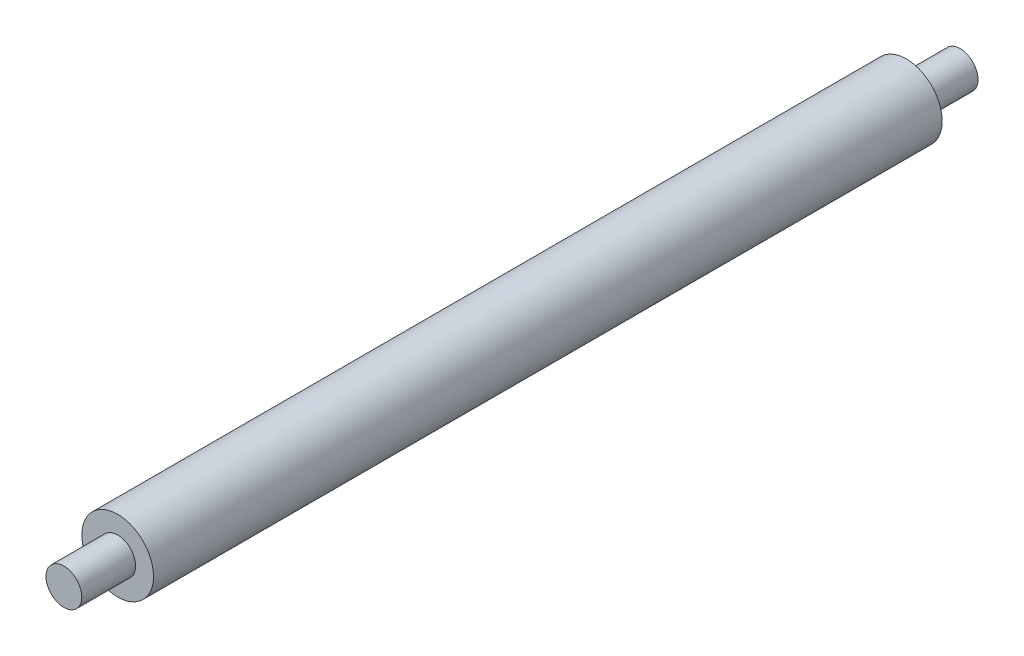
ISO-10303-21;
HEADER;
FILE_DESCRIPTION(('STEP AP214'),'2;1');
FILE_NAME('part.step','',(''),(''),'','','');
FILE_SCHEMA(('AUTOMOTIVE_DESIGN { 1 0 10303 214 1 1 1 1 }'));
ENDSEC;
DATA;
#1=APPLICATION_CONTEXT('core data for automotive mechanical design processes');
#2=APPLICATION_PROTOCOL_DEFINITION('international standard','automotive_design',2000,#1);
#3=PRODUCT_CONTEXT('',#1,'mechanical');
#4=PRODUCT('Part','Part','',(#3));
#5=PRODUCT_RELATED_PRODUCT_CATEGORY('part','',(#4));
#6=PRODUCT_DEFINITION_FORMATION('','',#4);
#7=PRODUCT_DEFINITION_CONTEXT('part definition',#1,'design');
#8=PRODUCT_DEFINITION('design','',#6,#7);
#9=PRODUCT_DEFINITION_SHAPE('','',#8);
#10=(LENGTH_UNIT() NAMED_UNIT(*) SI_UNIT(.MILLI.,.METRE.));
#11=(NAMED_UNIT(*) PLANE_ANGLE_UNIT() SI_UNIT($,.RADIAN.));
#12=(NAMED_UNIT(*) SI_UNIT($,.STERADIAN.) SOLID_ANGLE_UNIT());
#13=UNCERTAINTY_MEASURE_WITH_UNIT(LENGTH_MEASURE(1.E-05),#10,'distance_accuracy_value','');
#14=(GEOMETRIC_REPRESENTATION_CONTEXT(3) GLOBAL_UNCERTAINTY_ASSIGNED_CONTEXT((#13)) GLOBAL_UNIT_ASSIGNED_CONTEXT((#10,
#11,#12)) REPRESENTATION_CONTEXT('',''));
#15=CARTESIAN_POINT('',(0.,0.,0.));
#16=DIRECTION('',(0.,0.,1.));
#17=DIRECTION('',(1.,0.,0.));
#18=AXIS2_PLACEMENT_3D('',#15,#16,#17);
#19=CARTESIAN_POINT('',(0.,0.,-220.));
#20=DIRECTION('',(0.,0.,1.));
#21=DIRECTION('',(1.,0.,0.));
#22=AXIS2_PLACEMENT_3D('',#19,#20,#21);
#23=CYLINDRICAL_SURFACE('',#22,20.);
#24=CARTESIAN_POINT('',(0.,0.,-220.));
#25=DIRECTION('',(0.,0.,1.));
#26=DIRECTION('',(1.,0.,0.));
#27=AXIS2_PLACEMENT_3D('',#24,#25,#26);
#28=CIRCLE('',#27,20.);
#29=CARTESIAN_POINT('',(20.,0.,-220.));
#30=VERTEX_POINT('',#29);
#31=EDGE_CURVE('E40',#30,#30,#28,.T.);
#32=ORIENTED_EDGE('',*,*,#31,.T.);
#33=EDGE_LOOP('',(#32));
#34=FACE_BOUND('',#33,.T.);
#35=CARTESIAN_POINT('',(0.,0.,220.));
#36=DIRECTION('',(0.,0.,1.));
#37=DIRECTION('',(1.,0.,0.));
#38=AXIS2_PLACEMENT_3D('',#35,#36,#37);
#39=CIRCLE('',#38,20.);
#40=CARTESIAN_POINT('',(20.,0.,220.));
#41=VERTEX_POINT('',#40);
#42=EDGE_CURVE('E58',#41,#41,#39,.T.);
#43=ORIENTED_EDGE('',*,*,#42,.F.);
#44=EDGE_LOOP('',(#43));
#45=FACE_BOUND('',#44,.T.);
#46=ADVANCED_FACE('F37',(#34,#45),#23,.T.);
#47=CARTESIAN_POINT('',(0.,0.,-220.));
#48=DIRECTION('',(0.,0.,1.));
#49=DIRECTION('',(1.,0.,0.));
#50=AXIS2_PLACEMENT_3D('',#47,#48,#49);
#51=PLANE('',#50);
#52=CARTESIAN_POINT('',(0.,0.,-220.));
#53=DIRECTION('',(0.,0.,-1.));
#54=DIRECTION('',(-1.,0.,0.));
#55=AXIS2_PLACEMENT_3D('',#52,#53,#54);
#56=CIRCLE('',#55,10.);
#57=CARTESIAN_POINT('',(-10.,0.,-220.));
#58=VERTEX_POINT('',#57);
#59=EDGE_CURVE('E10',#58,#58,#56,.T.);
#60=ORIENTED_EDGE('',*,*,#59,.F.);
#61=EDGE_LOOP('',(#60));
#62=FACE_BOUND('',#61,.T.);
#63=ORIENTED_EDGE('',*,*,#31,.F.);
#64=EDGE_LOOP('',(#63));
#65=FACE_BOUND('',#64,.T.);
#66=ADVANCED_FACE('F69',(#62,#65),#51,.F.);
#67=CARTESIAN_POINT('',(0.,0.,220.));
#68=DIRECTION('',(0.,0.,1.));
#69=DIRECTION('',(1.,0.,0.));
#70=AXIS2_PLACEMENT_3D('',#67,#68,#69);
#71=PLANE('',#70);
#72=CARTESIAN_POINT('',(0.,0.,220.));
#73=DIRECTION('',(0.,0.,1.));
#74=DIRECTION('',(1.,0.,0.));
#75=AXIS2_PLACEMENT_3D('',#72,#73,#74);
#76=CIRCLE('',#75,10.);
#77=CARTESIAN_POINT('',(10.,0.,220.));
#78=VERTEX_POINT('',#77);
#79=EDGE_CURVE('E45',#78,#78,#76,.T.);
#80=ORIENTED_EDGE('',*,*,#79,.F.);
#81=EDGE_LOOP('',(#80));
#82=FACE_BOUND('',#81,.T.);
#83=ORIENTED_EDGE('',*,*,#42,.T.);
#84=EDGE_LOOP('',(#83));
#85=FACE_BOUND('',#84,.T.);
#86=ADVANCED_FACE('F71',(#82,#85),#71,.T.);
#87=CARTESIAN_POINT('',(0.,0.,250.));
#88=DIRECTION('',(0.,0.,-1.));
#89=DIRECTION('',(-1.,0.,0.));
#90=AXIS2_PLACEMENT_3D('',#87,#88,#89);
#91=CYLINDRICAL_SURFACE('',#90,10.);
#92=CARTESIAN_POINT('',(0.,0.,250.));
#93=DIRECTION('',(0.,0.,1.));
#94=DIRECTION('',(1.,0.,0.));
#95=AXIS2_PLACEMENT_3D('',#92,#93,#94);
#96=CIRCLE('',#95,10.);
#97=CARTESIAN_POINT('',(10.,0.,250.));
#98=VERTEX_POINT('',#97);
#99=EDGE_CURVE('E55',#98,#98,#96,.T.);
#100=ORIENTED_EDGE('',*,*,#99,.F.);
#101=EDGE_LOOP('',(#100));
#102=FACE_BOUND('',#101,.T.);
#103=ORIENTED_EDGE('',*,*,#79,.T.);
#104=EDGE_LOOP('',(#103));
#105=FACE_BOUND('',#104,.T.);
#106=ADVANCED_FACE('F77',(#102,#105),#91,.T.);
#107=CARTESIAN_POINT('',(0.,0.,250.));
#108=DIRECTION('',(0.,0.,1.));
#109=DIRECTION('',(1.,0.,0.));
#110=AXIS2_PLACEMENT_3D('',#107,#108,#109);
#111=PLANE('',#110);
#112=ORIENTED_EDGE('',*,*,#99,.T.);
#113=EDGE_LOOP('',(#112));
#114=FACE_BOUND('',#113,.T.);
#115=ADVANCED_FACE('F83',(#114),#111,.T.);
#116=CARTESIAN_POINT('',(0.,0.,-250.));
#117=DIRECTION('',(0.,0.,1.));
#118=DIRECTION('',(1.,0.,0.));
#119=AXIS2_PLACEMENT_3D('',#116,#117,#118);
#120=CYLINDRICAL_SURFACE('',#119,10.);
#121=CARTESIAN_POINT('',(0.,0.,-250.));
#122=DIRECTION('',(0.,0.,-1.));
#123=DIRECTION('',(-1.,0.,0.));
#124=AXIS2_PLACEMENT_3D('',#121,#122,#123);
#125=CIRCLE('',#124,10.);
#126=CARTESIAN_POINT('',(-10.,0.,-250.));
#127=VERTEX_POINT('',#126);
#128=EDGE_CURVE('E54',#127,#127,#125,.T.);
#129=ORIENTED_EDGE('',*,*,#128,.F.);
#130=EDGE_LOOP('',(#129));
#131=FACE_BOUND('',#130,.T.);
#132=ORIENTED_EDGE('',*,*,#59,.T.);
#133=EDGE_LOOP('',(#132));
#134=FACE_BOUND('',#133,.T.);
#135=ADVANCED_FACE('F87',(#131,#134),#120,.T.);
#136=CARTESIAN_POINT('',(0.,0.,-250.));
#137=DIRECTION('',(0.,0.,-1.));
#138=DIRECTION('',(-1.,0.,0.));
#139=AXIS2_PLACEMENT_3D('',#136,#137,#138);
#140=PLANE('',#139);
#141=ORIENTED_EDGE('',*,*,#128,.T.);
#142=EDGE_LOOP('',(#141));
#143=FACE_BOUND('',#142,.T.);
#144=ADVANCED_FACE('F91',(#143),#140,.T.);
#145=CLOSED_SHELL('',(#46,#66,#86,#106,#115,#135,#144));
#146=MANIFOLD_SOLID_BREP('B2',#145);
#147=ADVANCED_BREP_SHAPE_REPRESENTATION('',(#18,#146),#14);
#148=SHAPE_DEFINITION_REPRESENTATION(#9,#147);
ENDSEC;
END-ISO-10303-21;
